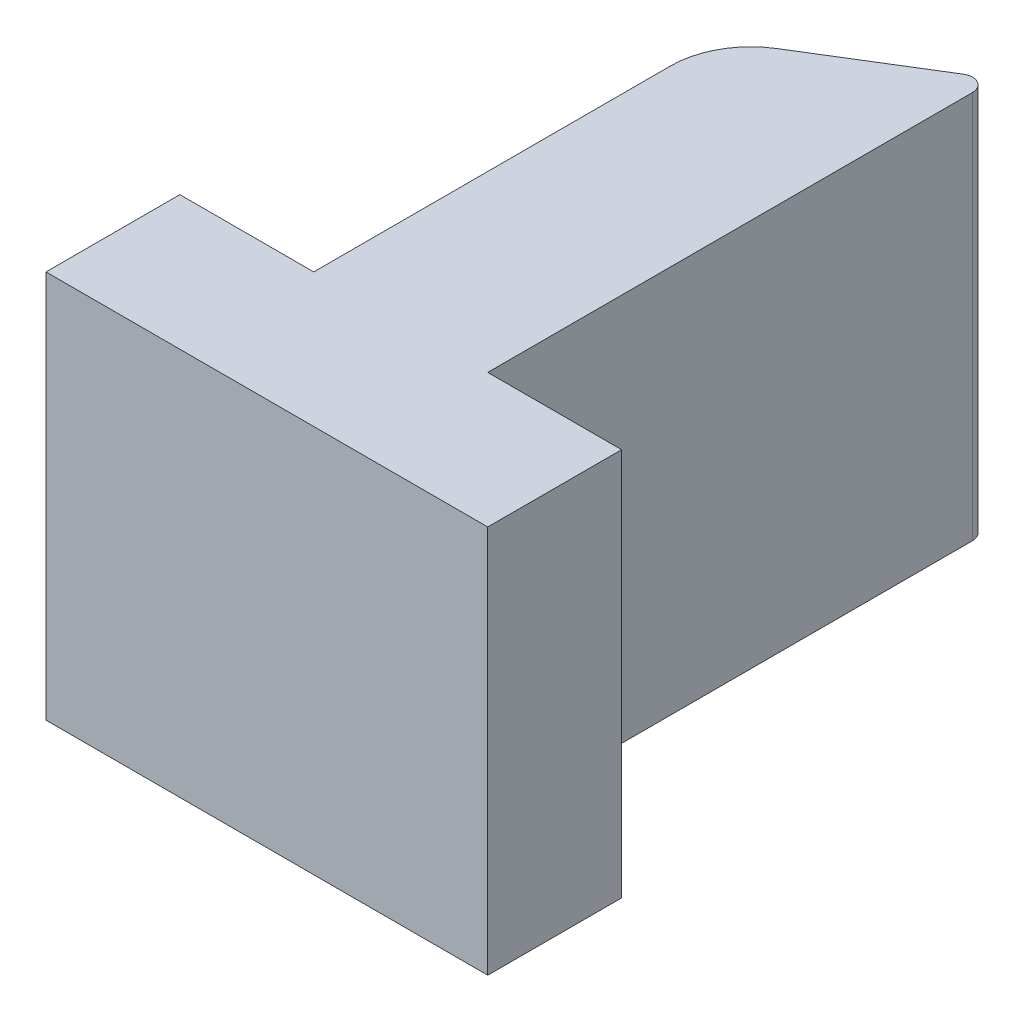
ISO-10303-21;
HEADER;
FILE_DESCRIPTION(('STEP AP214'),'2;1');
FILE_NAME('part.step','',(''),(''),'','','');
FILE_SCHEMA(('AUTOMOTIVE_DESIGN { 1 0 10303 214 1 1 1 1 }'));
ENDSEC;
DATA;
#1=APPLICATION_CONTEXT('core data for automotive mechanical design processes');
#2=APPLICATION_PROTOCOL_DEFINITION('international standard','automotive_design',2000,#1);
#3=PRODUCT_CONTEXT('',#1,'mechanical');
#4=PRODUCT('Part','Part','',(#3));
#5=PRODUCT_RELATED_PRODUCT_CATEGORY('part','',(#4));
#6=PRODUCT_DEFINITION_FORMATION('','',#4);
#7=PRODUCT_DEFINITION_CONTEXT('part definition',#1,'design');
#8=PRODUCT_DEFINITION('design','',#6,#7);
#9=PRODUCT_DEFINITION_SHAPE('','',#8);
#10=(LENGTH_UNIT() NAMED_UNIT(*) SI_UNIT(.MILLI.,.METRE.));
#11=(NAMED_UNIT(*) PLANE_ANGLE_UNIT() SI_UNIT($,.RADIAN.));
#12=(NAMED_UNIT(*) SI_UNIT($,.STERADIAN.) SOLID_ANGLE_UNIT());
#13=UNCERTAINTY_MEASURE_WITH_UNIT(LENGTH_MEASURE(1.E-05),#10,'distance_accuracy_value','');
#14=(GEOMETRIC_REPRESENTATION_CONTEXT(3) GLOBAL_UNCERTAINTY_ASSIGNED_CONTEXT((#13)) GLOBAL_UNIT_ASSIGNED_CONTEXT((#10,
#11,#12)) REPRESENTATION_CONTEXT('',''));
#15=CARTESIAN_POINT('',(0.,0.,0.));
#16=DIRECTION('',(0.,0.,1.));
#17=DIRECTION('',(1.,0.,0.));
#18=AXIS2_PLACEMENT_3D('',#15,#16,#17);
#19=CARTESIAN_POINT('',(0.,14.5,15.));
#20=DIRECTION('',(1.,0.,0.));
#21=DIRECTION('',(0.,0.,-1.));
#22=AXIS2_PLACEMENT_3D('',#19,#20,#21);
#23=PLANE('',#22);
#24=DIRECTION('',(0.,0.,1.));
#25=VECTOR('',#24,1.);
#26=CARTESIAN_POINT('',(0.,14.5,15.));
#27=LINE('',#26,#25);
#28=CARTESIAN_POINT('',(0.,14.5,1.67638558210932));
#29=VERTEX_POINT('',#28);
#30=CARTESIAN_POINT('',(0.,14.5,15.));
#31=VERTEX_POINT('',#30);
#32=EDGE_CURVE('E110',#29,#31,#27,.T.);
#33=ORIENTED_EDGE('',*,*,#32,.F.);
#34=DIRECTION('',(0.,-1.,0.));
#35=VECTOR('',#34,1.);
#36=CARTESIAN_POINT('',(0.,14.5,1.67638558210932));
#37=LINE('',#36,#35);
#38=CARTESIAN_POINT('',(0.,0.,1.67638558210932));
#39=VERTEX_POINT('',#38);
#40=EDGE_CURVE('E135',#29,#39,#37,.T.);
#41=ORIENTED_EDGE('',*,*,#40,.T.);
#42=DIRECTION('',(0.,0.,1.));
#43=VECTOR('',#42,1.);
#44=CARTESIAN_POINT('',(0.,0.,15.));
#45=LINE('',#44,#43);
#46=CARTESIAN_POINT('',(0.,0.,15.));
#47=VERTEX_POINT('',#46);
#48=EDGE_CURVE('E133',#39,#47,#45,.T.);
#49=ORIENTED_EDGE('',*,*,#48,.T.);
#50=DIRECTION('',(0.,-1.,0.));
#51=VECTOR('',#50,1.);
#52=CARTESIAN_POINT('',(0.,14.5,15.));
#53=LINE('',#52,#51);
#54=EDGE_CURVE('E126',#31,#47,#53,.T.);
#55=ORIENTED_EDGE('',*,*,#54,.F.);
#56=EDGE_LOOP('',(#33,#41,#49,#55));
#57=FACE_BOUND('',#56,.T.);
#58=ADVANCED_FACE('F34',(#57),#23,.F.);
#59=CARTESIAN_POINT('',(-5.,14.5,15.));
#60=DIRECTION('',(0.,0.,1.));
#61=DIRECTION('',(1.,0.,0.));
#62=AXIS2_PLACEMENT_3D('',#59,#60,#61);
#63=PLANE('',#62);
#64=DIRECTION('',(-1.,0.,0.));
#65=VECTOR('',#64,1.);
#66=CARTESIAN_POINT('',(-5.,0.,15.));
#67=LINE('',#66,#65);
#68=CARTESIAN_POINT('',(-5.,0.,15.));
#69=VERTEX_POINT('',#68);
#70=EDGE_CURVE('E192',#47,#69,#67,.T.);
#71=ORIENTED_EDGE('',*,*,#70,.T.);
#72=DIRECTION('',(0.,-1.,0.));
#73=VECTOR('',#72,1.);
#74=CARTESIAN_POINT('',(-5.,14.5,15.));
#75=LINE('',#74,#73);
#76=CARTESIAN_POINT('',(-5.,14.5,15.));
#77=VERTEX_POINT('',#76);
#78=EDGE_CURVE('E128',#77,#69,#75,.T.);
#79=ORIENTED_EDGE('',*,*,#78,.F.);
#80=DIRECTION('',(-1.,0.,0.));
#81=VECTOR('',#80,1.);
#82=CARTESIAN_POINT('',(-5.,14.5,15.));
#83=LINE('',#82,#81);
#84=EDGE_CURVE('E113',#31,#77,#83,.T.);
#85=ORIENTED_EDGE('',*,*,#84,.F.);
#86=ORIENTED_EDGE('',*,*,#54,.T.);
#87=EDGE_LOOP('',(#71,#79,#85,#86));
#88=FACE_BOUND('',#87,.T.);
#89=ADVANCED_FACE('F125',(#88),#63,.F.);
#90=CARTESIAN_POINT('',(-5.,14.5,20.));
#91=DIRECTION('',(1.,0.,0.));
#92=DIRECTION('',(0.,0.,-1.));
#93=AXIS2_PLACEMENT_3D('',#90,#91,#92);
#94=PLANE('',#93);
#95=DIRECTION('',(0.,0.,1.));
#96=VECTOR('',#95,1.);
#97=CARTESIAN_POINT('',(-5.,0.,20.));
#98=LINE('',#97,#96);
#99=CARTESIAN_POINT('',(-5.,0.,20.));
#100=VERTEX_POINT('',#99);
#101=EDGE_CURVE('E187',#69,#100,#98,.T.);
#102=ORIENTED_EDGE('',*,*,#101,.T.);
#103=DIRECTION('',(0.,-1.,0.));
#104=VECTOR('',#103,1.);
#105=CARTESIAN_POINT('',(-5.,14.5,20.));
#106=LINE('',#105,#104);
#107=CARTESIAN_POINT('',(-5.,14.5,20.));
#108=VERTEX_POINT('',#107);
#109=EDGE_CURVE('E139',#108,#100,#106,.T.);
#110=ORIENTED_EDGE('',*,*,#109,.F.);
#111=DIRECTION('',(0.,0.,1.));
#112=VECTOR('',#111,1.);
#113=CARTESIAN_POINT('',(-5.,14.5,20.));
#114=LINE('',#113,#112);
#115=EDGE_CURVE('E130',#77,#108,#114,.T.);
#116=ORIENTED_EDGE('',*,*,#115,.F.);
#117=ORIENTED_EDGE('',*,*,#78,.T.);
#118=EDGE_LOOP('',(#102,#110,#116,#117));
#119=FACE_BOUND('',#118,.T.);
#120=ADVANCED_FACE('F209',(#119),#94,.F.);
#121=CARTESIAN_POINT('',(11.5,14.5,20.));
#122=DIRECTION('',(0.,0.,-1.));
#123=DIRECTION('',(-1.,0.,0.));
#124=AXIS2_PLACEMENT_3D('',#121,#122,#123);
#125=PLANE('',#124);
#126=DIRECTION('',(1.,0.,0.));
#127=VECTOR('',#126,1.);
#128=CARTESIAN_POINT('',(11.5,0.,20.));
#129=LINE('',#128,#127);
#130=CARTESIAN_POINT('',(11.5,0.,20.));
#131=VERTEX_POINT('',#130);
#132=EDGE_CURVE('E182',#100,#131,#129,.T.);
#133=ORIENTED_EDGE('',*,*,#132,.T.);
#134=DIRECTION('',(0.,-1.,0.));
#135=VECTOR('',#134,1.);
#136=CARTESIAN_POINT('',(11.5,14.5,20.));
#137=LINE('',#136,#135);
#138=CARTESIAN_POINT('',(11.5,14.5,20.));
#139=VERTEX_POINT('',#138);
#140=EDGE_CURVE('E173',#139,#131,#137,.T.);
#141=ORIENTED_EDGE('',*,*,#140,.F.);
#142=DIRECTION('',(1.,0.,0.));
#143=VECTOR('',#142,1.);
#144=CARTESIAN_POINT('',(11.5,14.5,20.));
#145=LINE('',#144,#143);
#146=EDGE_CURVE('E183',#108,#139,#145,.T.);
#147=ORIENTED_EDGE('',*,*,#146,.F.);
#148=ORIENTED_EDGE('',*,*,#109,.T.);
#149=EDGE_LOOP('',(#133,#141,#147,#148));
#150=FACE_BOUND('',#149,.T.);
#151=ADVANCED_FACE('F180',(#150),#125,.F.);
#152=CARTESIAN_POINT('',(11.5,14.5,15.));
#153=DIRECTION('',(-1.,0.,0.));
#154=DIRECTION('',(0.,0.,1.));
#155=AXIS2_PLACEMENT_3D('',#152,#153,#154);
#156=PLANE('',#155);
#157=DIRECTION('',(0.,0.,-1.));
#158=VECTOR('',#157,1.);
#159=CARTESIAN_POINT('',(11.5,0.,15.));
#160=LINE('',#159,#158);
#161=CARTESIAN_POINT('',(11.5,0.,15.));
#162=VERTEX_POINT('',#161);
#163=EDGE_CURVE('E189',#131,#162,#160,.T.);
#164=ORIENTED_EDGE('',*,*,#163,.T.);
#165=DIRECTION('',(0.,-1.,0.));
#166=VECTOR('',#165,1.);
#167=CARTESIAN_POINT('',(11.5,14.5,15.));
#168=LINE('',#167,#166);
#169=CARTESIAN_POINT('',(11.5,14.5,15.));
#170=VERTEX_POINT('',#169);
#171=EDGE_CURVE('E170',#170,#162,#168,.T.);
#172=ORIENTED_EDGE('',*,*,#171,.F.);
#173=DIRECTION('',(0.,0.,-1.));
#174=VECTOR('',#173,1.);
#175=CARTESIAN_POINT('',(11.5,14.5,15.));
#176=LINE('',#175,#174);
#177=EDGE_CURVE('E205',#139,#170,#176,.T.);
#178=ORIENTED_EDGE('',*,*,#177,.F.);
#179=ORIENTED_EDGE('',*,*,#140,.T.);
#180=EDGE_LOOP('',(#164,#172,#178,#179));
#181=FACE_BOUND('',#180,.T.);
#182=ADVANCED_FACE('F214',(#181),#156,.F.);
#183=CARTESIAN_POINT('',(6.5,14.5,15.));
#184=DIRECTION('',(0.,0.,1.));
#185=DIRECTION('',(1.,0.,0.));
#186=AXIS2_PLACEMENT_3D('',#183,#184,#185);
#187=PLANE('',#186);
#188=DIRECTION('',(-1.,0.,0.));
#189=VECTOR('',#188,1.);
#190=CARTESIAN_POINT('',(6.5,0.,15.));
#191=LINE('',#190,#189);
#192=CARTESIAN_POINT('',(6.5,0.,15.));
#193=VERTEX_POINT('',#192);
#194=EDGE_CURVE('E163',#162,#193,#191,.T.);
#195=ORIENTED_EDGE('',*,*,#194,.T.);
#196=DIRECTION('',(0.,-1.,0.));
#197=VECTOR('',#196,1.);
#198=CARTESIAN_POINT('',(6.5,14.5,15.));
#199=LINE('',#198,#197);
#200=CARTESIAN_POINT('',(6.5,14.5,15.));
#201=VERTEX_POINT('',#200);
#202=EDGE_CURVE('E167',#201,#193,#199,.T.);
#203=ORIENTED_EDGE('',*,*,#202,.F.);
#204=DIRECTION('',(-1.,0.,0.));
#205=VECTOR('',#204,1.);
#206=CARTESIAN_POINT('',(6.5,14.5,15.));
#207=LINE('',#206,#205);
#208=EDGE_CURVE('E202',#170,#201,#207,.T.);
#209=ORIENTED_EDGE('',*,*,#208,.F.);
#210=ORIENTED_EDGE('',*,*,#171,.T.);
#211=EDGE_LOOP('',(#195,#203,#209,#210));
#212=FACE_BOUND('',#211,.T.);
#213=ADVANCED_FACE('F197',(#212),#187,.F.);
#214=CARTESIAN_POINT('',(6.5,14.5,-4.));
#215=DIRECTION('',(-1.,0.,0.));
#216=DIRECTION('',(0.,0.,1.));
#217=AXIS2_PLACEMENT_3D('',#214,#215,#216);
#218=PLANE('',#217);
#219=DIRECTION('',(0.,0.,-1.));
#220=VECTOR('',#219,1.);
#221=CARTESIAN_POINT('',(6.5,0.,-4.));
#222=LINE('',#221,#220);
#223=CARTESIAN_POINT('',(6.5,0.,-3.10521778759716));
#224=VERTEX_POINT('',#223);
#225=EDGE_CURVE('E161',#193,#224,#222,.T.);
#226=ORIENTED_EDGE('',*,*,#225,.T.);
#227=DIRECTION('',(0.,-1.,0.));
#228=VECTOR('',#227,1.);
#229=CARTESIAN_POINT('',(6.5,14.5,-3.10521778759716));
#230=LINE('',#229,#228);
#231=CARTESIAN_POINT('',(6.5,14.5,-3.10521778759716));
#232=VERTEX_POINT('',#231);
#233=EDGE_CURVE('E42',#224,#232,#230,.F.);
#234=ORIENTED_EDGE('',*,*,#233,.T.);
#235=DIRECTION('',(0.,0.,-1.));
#236=VECTOR('',#235,1.);
#237=CARTESIAN_POINT('',(6.5,14.5,-4.));
#238=LINE('',#237,#236);
#239=EDGE_CURVE('E201',#201,#232,#238,.T.);
#240=ORIENTED_EDGE('',*,*,#239,.F.);
#241=ORIENTED_EDGE('',*,*,#202,.T.);
#242=EDGE_LOOP('',(#226,#234,#240,#241));
#243=FACE_BOUND('',#242,.T.);
#244=ADVANCED_FACE('F200',(#243),#218,.F.);
#245=CARTESIAN_POINT('',(0.,14.5,0.));
#246=DIRECTION('',(0.524097425664335,0.,0.851658316704544));
#247=DIRECTION('',(0.851658316704544,0.,-0.524097425664335));
#248=AXIS2_PLACEMENT_3D('',#245,#246,#247);
#249=PLANE('',#248);
#250=DIRECTION('',(-0.851658316704544,0.,0.524097425664335));
#251=VECTOR('',#250,1.);
#252=CARTESIAN_POINT('',(0.,14.5,0.));
#253=LINE('',#252,#251);
#254=CARTESIAN_POINT('',(5.73795128716783,14.5,-3.53104694594944));
#255=VERTEX_POINT('',#254);
#256=CARTESIAN_POINT('',(1.427707723007,14.5,-0.878589368004306));
#257=VERTEX_POINT('',#256);
#258=EDGE_CURVE('E156',#255,#257,#253,.T.);
#259=ORIENTED_EDGE('',*,*,#258,.F.);
#260=DIRECTION('',(0.,-1.,0.));
#261=VECTOR('',#260,1.);
#262=CARTESIAN_POINT('',(5.73795128716783,14.5,-3.53104694594944));
#263=LINE('',#262,#261);
#264=CARTESIAN_POINT('',(5.73795128716783,0.,-3.53104694594944));
#265=VERTEX_POINT('',#264);
#266=EDGE_CURVE('E149',#255,#265,#263,.T.);
#267=ORIENTED_EDGE('',*,*,#266,.T.);
#268=DIRECTION('',(-0.851658316704544,0.,0.524097425664335));
#269=VECTOR('',#268,1.);
#270=CARTESIAN_POINT('',(0.,0.,0.));
#271=LINE('',#270,#269);
#272=CARTESIAN_POINT('',(1.427707723007,0.,-0.878589368004306));
#273=VERTEX_POINT('',#272);
#274=EDGE_CURVE('E121',#265,#273,#271,.T.);
#275=ORIENTED_EDGE('',*,*,#274,.T.);
#276=DIRECTION('',(0.,-1.,0.));
#277=VECTOR('',#276,1.);
#278=CARTESIAN_POINT('',(1.427707723007,14.5,-0.878589368004305));
#279=LINE('',#278,#277);
#280=EDGE_CURVE('E145',#273,#257,#279,.F.);
#281=ORIENTED_EDGE('',*,*,#280,.T.);
#282=EDGE_LOOP('',(#259,#267,#275,#281));
#283=FACE_BOUND('',#282,.T.);
#284=ADVANCED_FACE('F155',(#283),#249,.F.);
#285=CARTESIAN_POINT('',(0.,14.5,0.));
#286=DIRECTION('',(0.,-1.,0.));
#287=DIRECTION('',(0.,0.,-1.));
#288=AXIS2_PLACEMENT_3D('',#285,#286,#287);
#289=PLANE('',#288);
#290=ORIENTED_EDGE('',*,*,#239,.T.);
#291=CARTESIAN_POINT('',(6.,14.5,-3.10521778759716));
#292=DIRECTION('',(0.,-1.,0.));
#293=DIRECTION('',(0.,0.,-1.));
#294=AXIS2_PLACEMENT_3D('',#291,#292,#293);
#295=CIRCLE('',#294,0.5);
#296=EDGE_CURVE('E11',#232,#255,#295,.F.);
#297=ORIENTED_EDGE('',*,*,#296,.T.);
#298=ORIENTED_EDGE('',*,*,#258,.T.);
#299=CARTESIAN_POINT('',(3.,14.5,1.67638558210932));
#300=DIRECTION('',(0.,-1.,0.));
#301=DIRECTION('',(0.,0.,-1.));
#302=AXIS2_PLACEMENT_3D('',#299,#300,#301);
#303=CIRCLE('',#302,3.);
#304=EDGE_CURVE('E116',#257,#29,#303,.F.);
#305=ORIENTED_EDGE('',*,*,#304,.T.);
#306=ORIENTED_EDGE('',*,*,#32,.T.);
#307=ORIENTED_EDGE('',*,*,#84,.T.);
#308=ORIENTED_EDGE('',*,*,#115,.T.);
#309=ORIENTED_EDGE('',*,*,#146,.T.);
#310=ORIENTED_EDGE('',*,*,#177,.T.);
#311=ORIENTED_EDGE('',*,*,#208,.T.);
#312=EDGE_LOOP('',(#290,#297,#298,#305,#306,#307,#308,#309,#310,#311));
#313=FACE_BOUND('',#312,.T.);
#314=ADVANCED_FACE('F112',(#313),#289,.F.);
#315=CARTESIAN_POINT('',(0.,0.,0.));
#316=DIRECTION('',(0.,-1.,0.));
#317=DIRECTION('',(0.,0.,-1.));
#318=AXIS2_PLACEMENT_3D('',#315,#316,#317);
#319=PLANE('',#318);
#320=ORIENTED_EDGE('',*,*,#274,.F.);
#321=CARTESIAN_POINT('',(6.,0.,-3.10521778759716));
#322=DIRECTION('',(0.,-1.,0.));
#323=DIRECTION('',(0.,0.,-1.));
#324=AXIS2_PLACEMENT_3D('',#321,#322,#323);
#325=CIRCLE('',#324,0.5);
#326=EDGE_CURVE('E56',#265,#224,#325,.T.);
#327=ORIENTED_EDGE('',*,*,#326,.T.);
#328=ORIENTED_EDGE('',*,*,#225,.F.);
#329=ORIENTED_EDGE('',*,*,#194,.F.);
#330=ORIENTED_EDGE('',*,*,#163,.F.);
#331=ORIENTED_EDGE('',*,*,#132,.F.);
#332=ORIENTED_EDGE('',*,*,#101,.F.);
#333=ORIENTED_EDGE('',*,*,#70,.F.);
#334=ORIENTED_EDGE('',*,*,#48,.F.);
#335=CARTESIAN_POINT('',(3.,0.,1.67638558210932));
#336=DIRECTION('',(0.,-1.,0.));
#337=DIRECTION('',(0.,0.,-1.));
#338=AXIS2_PLACEMENT_3D('',#335,#336,#337);
#339=CIRCLE('',#338,3.);
#340=EDGE_CURVE('E137',#39,#273,#339,.T.);
#341=ORIENTED_EDGE('',*,*,#340,.T.);
#342=EDGE_LOOP('',(#320,#327,#328,#329,#330,#331,#332,#333,#334,#341));
#343=FACE_BOUND('',#342,.T.);
#344=ADVANCED_FACE('F159',(#343),#319,.T.);
#345=CARTESIAN_POINT('',(3.,14.5,1.67638558210932));
#346=DIRECTION('',(0.,-1.,0.));
#347=DIRECTION('',(0.,0.,-1.));
#348=AXIS2_PLACEMENT_3D('',#345,#346,#347);
#349=CYLINDRICAL_SURFACE('',#348,3.);
#350=ORIENTED_EDGE('',*,*,#304,.F.);
#351=ORIENTED_EDGE('',*,*,#280,.F.);
#352=ORIENTED_EDGE('',*,*,#340,.F.);
#353=ORIENTED_EDGE('',*,*,#40,.F.);
#354=EDGE_LOOP('',(#350,#351,#352,#353));
#355=FACE_BOUND('',#354,.T.);
#356=ADVANCED_FACE('F230',(#355),#349,.T.);
#357=CARTESIAN_POINT('',(6.,14.5,-3.10521778759716));
#358=DIRECTION('',(0.,-1.,0.));
#359=DIRECTION('',(0.,0.,-1.));
#360=AXIS2_PLACEMENT_3D('',#357,#358,#359);
#361=CYLINDRICAL_SURFACE('',#360,0.5);
#362=ORIENTED_EDGE('',*,*,#296,.F.);
#363=ORIENTED_EDGE('',*,*,#233,.F.);
#364=ORIENTED_EDGE('',*,*,#326,.F.);
#365=ORIENTED_EDGE('',*,*,#266,.F.);
#366=EDGE_LOOP('',(#362,#363,#364,#365));
#367=FACE_BOUND('',#366,.T.);
#368=ADVANCED_FACE('F36',(#367),#361,.T.);
#369=CLOSED_SHELL('',(#58,#89,#120,#151,#182,#213,#244,#284,#314,#344,#356,#368));
#370=MANIFOLD_SOLID_BREP('B2',#369);
#371=ADVANCED_BREP_SHAPE_REPRESENTATION('',(#18,#370),#14);
#372=SHAPE_DEFINITION_REPRESENTATION(#9,#371);
ENDSEC;
END-ISO-10303-21;
